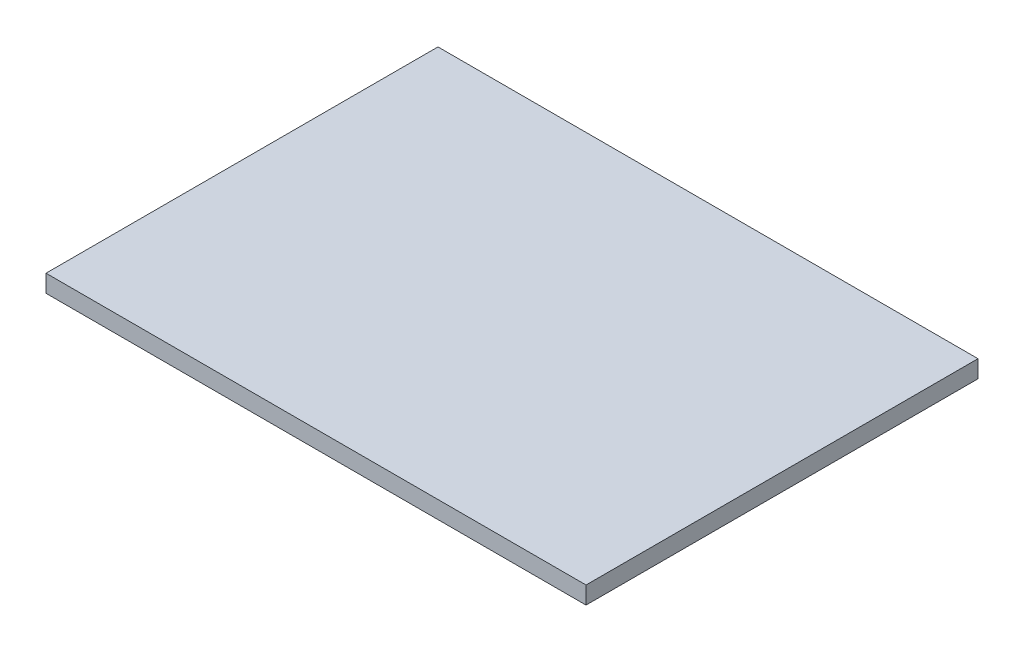
ISO-10303-21;
HEADER;
FILE_DESCRIPTION(('STEP AP214'),'2;1');
FILE_NAME('part.step','',(''),(''),'','','');
FILE_SCHEMA(('AUTOMOTIVE_DESIGN { 1 0 10303 214 1 1 1 1 }'));
ENDSEC;
DATA;
#1=APPLICATION_CONTEXT('core data for automotive mechanical design processes');
#2=APPLICATION_PROTOCOL_DEFINITION('international standard','automotive_design',2000,#1);
#3=PRODUCT_CONTEXT('',#1,'mechanical');
#4=PRODUCT('Part','Part','',(#3));
#5=PRODUCT_RELATED_PRODUCT_CATEGORY('part','',(#4));
#6=PRODUCT_DEFINITION_FORMATION('','',#4);
#7=PRODUCT_DEFINITION_CONTEXT('part definition',#1,'design');
#8=PRODUCT_DEFINITION('design','',#6,#7);
#9=PRODUCT_DEFINITION_SHAPE('','',#8);
#10=(LENGTH_UNIT() NAMED_UNIT(*) SI_UNIT(.MILLI.,.METRE.));
#11=(NAMED_UNIT(*) PLANE_ANGLE_UNIT() SI_UNIT($,.RADIAN.));
#12=(NAMED_UNIT(*) SI_UNIT($,.STERADIAN.) SOLID_ANGLE_UNIT());
#13=UNCERTAINTY_MEASURE_WITH_UNIT(LENGTH_MEASURE(1.E-05),#10,'distance_accuracy_value','');
#14=(GEOMETRIC_REPRESENTATION_CONTEXT(3) GLOBAL_UNCERTAINTY_ASSIGNED_CONTEXT((#13)) GLOBAL_UNIT_ASSIGNED_CONTEXT((#10,
#11,#12)) REPRESENTATION_CONTEXT('',''));
#15=CARTESIAN_POINT('',(0.,0.,0.));
#16=DIRECTION('',(0.,0.,1.));
#17=DIRECTION('',(1.,0.,0.));
#18=AXIS2_PLACEMENT_3D('',#15,#16,#17);
#19=CARTESIAN_POINT('',(31.,2.,22.5));
#20=DIRECTION('',(-1.,0.,0.));
#21=DIRECTION('',(0.,0.,1.));
#22=AXIS2_PLACEMENT_3D('',#19,#20,#21);
#23=PLANE('',#22);
#24=DIRECTION('',(0.,0.,-1.));
#25=VECTOR('',#24,1.);
#26=CARTESIAN_POINT('',(31.,0.,22.5));
#27=LINE('',#26,#25);
#28=CARTESIAN_POINT('',(31.,0.,22.5));
#29=VERTEX_POINT('',#28);
#30=CARTESIAN_POINT('',(31.,0.,-22.5));
#31=VERTEX_POINT('',#30);
#32=EDGE_CURVE('E107',#29,#31,#27,.T.);
#33=ORIENTED_EDGE('',*,*,#32,.T.);
#34=DIRECTION('',(0.,-1.,0.));
#35=VECTOR('',#34,1.);
#36=CARTESIAN_POINT('',(31.,2.,-22.5));
#37=LINE('',#36,#35);
#38=CARTESIAN_POINT('',(31.,2.,-22.5));
#39=VERTEX_POINT('',#38);
#40=EDGE_CURVE('E11',#39,#31,#37,.T.);
#41=ORIENTED_EDGE('',*,*,#40,.F.);
#42=DIRECTION('',(0.,0.,-1.));
#43=VECTOR('',#42,1.);
#44=CARTESIAN_POINT('',(31.,2.,22.5));
#45=LINE('',#44,#43);
#46=CARTESIAN_POINT('',(31.,2.,22.5));
#47=VERTEX_POINT('',#46);
#48=EDGE_CURVE('E91',#47,#39,#45,.T.);
#49=ORIENTED_EDGE('',*,*,#48,.F.);
#50=DIRECTION('',(0.,-1.,0.));
#51=VECTOR('',#50,1.);
#52=CARTESIAN_POINT('',(31.,2.,22.5));
#53=LINE('',#52,#51);
#54=EDGE_CURVE('E103',#47,#29,#53,.T.);
#55=ORIENTED_EDGE('',*,*,#54,.T.);
#56=EDGE_LOOP('',(#33,#41,#49,#55));
#57=FACE_BOUND('',#56,.T.);
#58=ADVANCED_FACE('F39',(#57),#23,.F.);
#59=CARTESIAN_POINT('',(-31.,2.,-22.5));
#60=DIRECTION('',(0.,0.,1.));
#61=DIRECTION('',(1.,0.,0.));
#62=AXIS2_PLACEMENT_3D('',#59,#60,#61);
#63=PLANE('',#62);
#64=DIRECTION('',(-1.,0.,0.));
#65=VECTOR('',#64,1.);
#66=CARTESIAN_POINT('',(-31.,0.,-22.5));
#67=LINE('',#66,#65);
#68=CARTESIAN_POINT('',(-31.,0.,-22.5));
#69=VERTEX_POINT('',#68);
#70=EDGE_CURVE('E96',#31,#69,#67,.T.);
#71=ORIENTED_EDGE('',*,*,#70,.T.);
#72=DIRECTION('',(0.,-1.,0.));
#73=VECTOR('',#72,1.);
#74=CARTESIAN_POINT('',(-31.,2.,-22.5));
#75=LINE('',#74,#73);
#76=CARTESIAN_POINT('',(-31.,2.,-22.5));
#77=VERTEX_POINT('',#76);
#78=EDGE_CURVE('E48',#77,#69,#75,.T.);
#79=ORIENTED_EDGE('',*,*,#78,.F.);
#80=DIRECTION('',(-1.,0.,0.));
#81=VECTOR('',#80,1.);
#82=CARTESIAN_POINT('',(-31.,2.,-22.5));
#83=LINE('',#82,#81);
#84=EDGE_CURVE('E86',#39,#77,#83,.T.);
#85=ORIENTED_EDGE('',*,*,#84,.F.);
#86=ORIENTED_EDGE('',*,*,#40,.T.);
#87=EDGE_LOOP('',(#71,#79,#85,#86));
#88=FACE_BOUND('',#87,.T.);
#89=ADVANCED_FACE('F95',(#88),#63,.F.);
#90=CARTESIAN_POINT('',(-31.,2.,22.5));
#91=DIRECTION('',(1.,0.,0.));
#92=DIRECTION('',(0.,0.,-1.));
#93=AXIS2_PLACEMENT_3D('',#90,#91,#92);
#94=PLANE('',#93);
#95=DIRECTION('',(0.,0.,1.));
#96=VECTOR('',#95,1.);
#97=CARTESIAN_POINT('',(-31.,0.,22.5));
#98=LINE('',#97,#96);
#99=CARTESIAN_POINT('',(-31.,0.,22.5));
#100=VERTEX_POINT('',#99);
#101=EDGE_CURVE('E73',#69,#100,#98,.T.);
#102=ORIENTED_EDGE('',*,*,#101,.T.);
#103=DIRECTION('',(0.,-1.,0.));
#104=VECTOR('',#103,1.);
#105=CARTESIAN_POINT('',(-31.,2.,22.5));
#106=LINE('',#105,#104);
#107=CARTESIAN_POINT('',(-31.,2.,22.5));
#108=VERTEX_POINT('',#107);
#109=EDGE_CURVE('E98',#108,#100,#106,.T.);
#110=ORIENTED_EDGE('',*,*,#109,.F.);
#111=DIRECTION('',(0.,0.,1.));
#112=VECTOR('',#111,1.);
#113=CARTESIAN_POINT('',(-31.,2.,22.5));
#114=LINE('',#113,#112);
#115=EDGE_CURVE('E89',#77,#108,#114,.T.);
#116=ORIENTED_EDGE('',*,*,#115,.F.);
#117=ORIENTED_EDGE('',*,*,#78,.T.);
#118=EDGE_LOOP('',(#102,#110,#116,#117));
#119=FACE_BOUND('',#118,.T.);
#120=ADVANCED_FACE('F99',(#119),#94,.F.);
#121=CARTESIAN_POINT('',(-31.,2.,22.5));
#122=DIRECTION('',(0.,0.,-1.));
#123=DIRECTION('',(-1.,0.,0.));
#124=AXIS2_PLACEMENT_3D('',#121,#122,#123);
#125=PLANE('',#124);
#126=DIRECTION('',(1.,0.,0.));
#127=VECTOR('',#126,1.);
#128=CARTESIAN_POINT('',(-31.,0.,22.5));
#129=LINE('',#128,#127);
#130=EDGE_CURVE('E79',#100,#29,#129,.T.);
#131=ORIENTED_EDGE('',*,*,#130,.T.);
#132=ORIENTED_EDGE('',*,*,#54,.F.);
#133=DIRECTION('',(1.,0.,0.));
#134=VECTOR('',#133,1.);
#135=CARTESIAN_POINT('',(-31.,2.,22.5));
#136=LINE('',#135,#134);
#137=EDGE_CURVE('E56',#108,#47,#136,.T.);
#138=ORIENTED_EDGE('',*,*,#137,.F.);
#139=ORIENTED_EDGE('',*,*,#109,.T.);
#140=EDGE_LOOP('',(#131,#132,#138,#139));
#141=FACE_BOUND('',#140,.T.);
#142=ADVANCED_FACE('F120',(#141),#125,.F.);
#143=CARTESIAN_POINT('',(0.,2.,0.));
#144=DIRECTION('',(0.,-1.,0.));
#145=DIRECTION('',(0.,0.,-1.));
#146=AXIS2_PLACEMENT_3D('',#143,#144,#145);
#147=PLANE('',#146);
#148=ORIENTED_EDGE('',*,*,#48,.T.);
#149=ORIENTED_EDGE('',*,*,#84,.T.);
#150=ORIENTED_EDGE('',*,*,#115,.T.);
#151=ORIENTED_EDGE('',*,*,#137,.T.);
#152=EDGE_LOOP('',(#148,#149,#150,#151));
#153=FACE_BOUND('',#152,.T.);
#154=ADVANCED_FACE('F87',(#153),#147,.F.);
#155=CARTESIAN_POINT('',(0.,0.,0.));
#156=DIRECTION('',(0.,-1.,0.));
#157=DIRECTION('',(0.,0.,-1.));
#158=AXIS2_PLACEMENT_3D('',#155,#156,#157);
#159=PLANE('',#158);
#160=ORIENTED_EDGE('',*,*,#32,.F.);
#161=ORIENTED_EDGE('',*,*,#130,.F.);
#162=ORIENTED_EDGE('',*,*,#101,.F.);
#163=ORIENTED_EDGE('',*,*,#70,.F.);
#164=EDGE_LOOP('',(#160,#161,#162,#163));
#165=FACE_BOUND('',#164,.T.);
#166=ADVANCED_FACE('F123',(#165),#159,.T.);
#167=CLOSED_SHELL('',(#58,#89,#120,#142,#154,#166));
#168=MANIFOLD_SOLID_BREP('B2',#167);
#169=ADVANCED_BREP_SHAPE_REPRESENTATION('',(#18,#168),#14);
#170=SHAPE_DEFINITION_REPRESENTATION(#9,#169);
ENDSEC;
END-ISO-10303-21;
